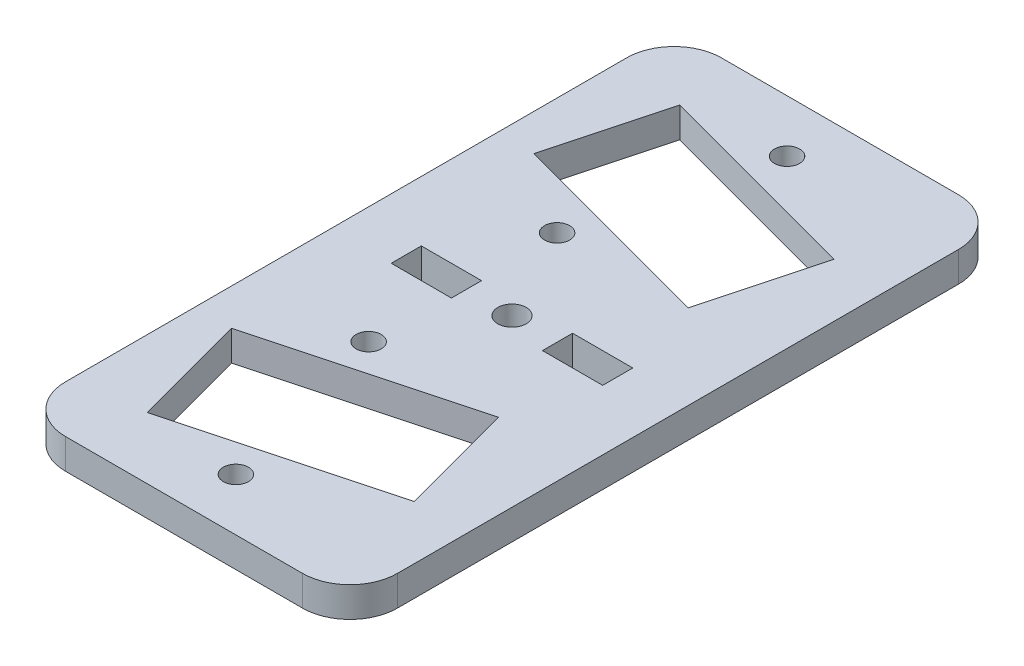
ISO-10303-21;
HEADER;
FILE_DESCRIPTION(('STEP AP214'),'2;1');
FILE_NAME('part.step','',(''),(''),'','','');
FILE_SCHEMA(('AUTOMOTIVE_DESIGN { 1 0 10303 214 1 1 1 1 }'));
ENDSEC;
DATA;
#1=APPLICATION_CONTEXT('core data for automotive mechanical design processes');
#2=APPLICATION_PROTOCOL_DEFINITION('international standard','automotive_design',2000,#1);
#3=PRODUCT_CONTEXT('',#1,'mechanical');
#4=PRODUCT('Part','Part','',(#3));
#5=PRODUCT_RELATED_PRODUCT_CATEGORY('part','',(#4));
#6=PRODUCT_DEFINITION_FORMATION('','',#4);
#7=PRODUCT_DEFINITION_CONTEXT('part definition',#1,'design');
#8=PRODUCT_DEFINITION('design','',#6,#7);
#9=PRODUCT_DEFINITION_SHAPE('','',#8);
#10=(LENGTH_UNIT() NAMED_UNIT(*) SI_UNIT(.MILLI.,.METRE.));
#11=(NAMED_UNIT(*) PLANE_ANGLE_UNIT() SI_UNIT($,.RADIAN.));
#12=(NAMED_UNIT(*) SI_UNIT($,.STERADIAN.) SOLID_ANGLE_UNIT());
#13=UNCERTAINTY_MEASURE_WITH_UNIT(LENGTH_MEASURE(1.E-05),#10,'distance_accuracy_value','');
#14=(GEOMETRIC_REPRESENTATION_CONTEXT(3) GLOBAL_UNCERTAINTY_ASSIGNED_CONTEXT((#13)) GLOBAL_UNIT_ASSIGNED_CONTEXT((#10,
#11,#12)) REPRESENTATION_CONTEXT('',''));
#15=CARTESIAN_POINT('',(0.,0.,0.));
#16=DIRECTION('',(0.,0.,1.));
#17=DIRECTION('',(1.,0.,0.));
#18=AXIS2_PLACEMENT_3D('',#15,#16,#17);
#19=CARTESIAN_POINT('',(241.907481729682,3.175,34.3947344048409));
#20=DIRECTION('',(0.,1.,0.));
#21=DIRECTION('',(0.,0.,1.));
#22=AXIS2_PLACEMENT_3D('',#19,#20,#21);
#23=PLANE('',#22);
#24=CARTESIAN_POINT('',(254.407481729682,3.175,4.8067810577674));
#25=DIRECTION('',(0.,1.,0.));
#26=DIRECTION('',(0.,0.,1.));
#27=AXIS2_PLACEMENT_3D('',#24,#25,#26);
#28=CIRCLE('',#27,1.50000000000002);
#29=CARTESIAN_POINT('',(254.407481729682,3.175,6.30678105776743));
#30=VERTEX_POINT('',#29);
#31=EDGE_CURVE('E229',#30,#30,#28,.T.);
#32=ORIENTED_EDGE('',*,*,#31,.F.);
#33=EDGE_LOOP('',(#32));
#34=FACE_BOUND('',#33,.T.);
#35=DIRECTION('',(-1.,0.,0.));
#36=VECTOR('',#35,1.);
#37=CARTESIAN_POINT('',(243.257481729682,3.175,3.21928105776739));
#38=LINE('',#37,#36);
#39=CARTESIAN_POINT('',(249.607481729682,3.175,3.21928105776739));
#40=VERTEX_POINT('',#39);
#41=CARTESIAN_POINT('',(243.257481729682,3.175,3.21928105776739));
#42=VERTEX_POINT('',#41);
#43=EDGE_CURVE('E268',#40,#42,#38,.T.);
#44=ORIENTED_EDGE('',*,*,#43,.F.);
#45=DIRECTION('',(0.,0.,-1.));
#46=VECTOR('',#45,1.);
#47=CARTESIAN_POINT('',(249.607481729682,3.175,6.39428105776739));
#48=LINE('',#47,#46);
#49=CARTESIAN_POINT('',(249.607481729682,3.175,6.39428105776739));
#50=VERTEX_POINT('',#49);
#51=EDGE_CURVE('E266',#50,#40,#48,.T.);
#52=ORIENTED_EDGE('',*,*,#51,.F.);
#53=DIRECTION('',(1.,0.,0.));
#54=VECTOR('',#53,1.);
#55=CARTESIAN_POINT('',(243.257481729682,3.175,6.39428105776739));
#56=LINE('',#55,#54);
#57=CARTESIAN_POINT('',(243.257481729682,3.175,6.39428105776739));
#58=VERTEX_POINT('',#57);
#59=EDGE_CURVE('E274',#58,#50,#56,.T.);
#60=ORIENTED_EDGE('',*,*,#59,.F.);
#61=DIRECTION('',(0.,0.,1.));
#62=VECTOR('',#61,1.);
#63=CARTESIAN_POINT('',(243.257481729682,3.175,6.39428105776739));
#64=LINE('',#63,#62);
#65=EDGE_CURVE('E271',#42,#58,#64,.T.);
#66=ORIENTED_EDGE('',*,*,#65,.F.);
#67=EDGE_LOOP('',(#44,#52,#60,#66));
#68=FACE_BOUND('',#67,.T.);
#69=CARTESIAN_POINT('',(254.350862196904,3.175,33.8702321091199));
#70=DIRECTION('',(0.,1.,0.));
#71=DIRECTION('',(0.,0.,-1.));
#72=AXIS2_PLACEMENT_3D('',#69,#70,#71);
#73=CIRCLE('',#72,1.3248000009435);
#74=CARTESIAN_POINT('',(254.350862196904,3.175,32.5454321081764));
#75=VERTEX_POINT('',#74);
#76=EDGE_CURVE('E328',#75,#75,#73,.T.);
#77=ORIENTED_EDGE('',*,*,#76,.F.);
#78=EDGE_LOOP('',(#77));
#79=FACE_BOUND('',#78,.T.);
#80=CARTESIAN_POINT('',(249.226245103874,3.175,-5.13133863306153));
#81=DIRECTION('',(0.,1.,0.));
#82=DIRECTION('',(0.,0.,-1.));
#83=AXIS2_PLACEMENT_3D('',#80,#81,#82);
#84=CIRCLE('',#83,1.32480000094353);
#85=CARTESIAN_POINT('',(249.226245103874,3.175,-6.45613863400506));
#86=VERTEX_POINT('',#85);
#87=EDGE_CURVE('E340',#86,#86,#84,.T.);
#88=ORIENTED_EDGE('',*,*,#87,.F.);
#89=EDGE_LOOP('',(#88));
#90=FACE_BOUND('',#89,.T.);
#91=CARTESIAN_POINT('',(241.907481729682,3.175,34.3947344048409));
#92=DIRECTION('',(0.,1.,0.));
#93=DIRECTION('',(0.,0.,1.));
#94=AXIS2_PLACEMENT_3D('',#91,#92,#93);
#95=CIRCLE('',#94,5.);
#96=CARTESIAN_POINT('',(236.907481729682,3.175,34.3947344048409));
#97=VERTEX_POINT('',#96);
#98=CARTESIAN_POINT('',(241.907481729682,3.175,39.3947344048409));
#99=VERTEX_POINT('',#98);
#100=EDGE_CURVE('E352',#97,#99,#95,.T.);
#101=ORIENTED_EDGE('',*,*,#100,.T.);
#102=DIRECTION('',(1.,0.,0.));
#103=VECTOR('',#102,1.);
#104=CARTESIAN_POINT('',(241.907481729682,3.175,39.3947344048409));
#105=LINE('',#104,#103);
#106=CARTESIAN_POINT('',(266.907481729682,3.175,39.3947344048409));
#107=VERTEX_POINT('',#106);
#108=EDGE_CURVE('E355',#99,#107,#105,.T.);
#109=ORIENTED_EDGE('',*,*,#108,.T.);
#110=CARTESIAN_POINT('',(266.907481729682,3.175,34.3947344048409));
#111=DIRECTION('',(0.,1.,0.));
#112=DIRECTION('',(0.,0.,1.));
#113=AXIS2_PLACEMENT_3D('',#110,#111,#112);
#114=CIRCLE('',#113,5.);
#115=CARTESIAN_POINT('',(271.907481729682,3.175,34.3947344048409));
#116=VERTEX_POINT('',#115);
#117=EDGE_CURVE('E358',#107,#116,#114,.T.);
#118=ORIENTED_EDGE('',*,*,#117,.T.);
#119=DIRECTION('',(0.,0.,-1.));
#120=VECTOR('',#119,1.);
#121=CARTESIAN_POINT('',(271.907481729682,3.175,-24.7811722893061));
#122=LINE('',#121,#120);
#123=CARTESIAN_POINT('',(271.907481729682,3.175,-24.7811722893061));
#124=VERTEX_POINT('',#123);
#125=EDGE_CURVE('E360',#116,#124,#122,.T.);
#126=ORIENTED_EDGE('',*,*,#125,.T.);
#127=CARTESIAN_POINT('',(266.907481729682,3.175,-24.7811722893061));
#128=DIRECTION('',(0.,1.,0.));
#129=DIRECTION('',(0.,0.,-1.));
#130=AXIS2_PLACEMENT_3D('',#127,#128,#129);
#131=CIRCLE('',#130,5.);
#132=CARTESIAN_POINT('',(266.907481729682,3.175,-29.7811722893061));
#133=VERTEX_POINT('',#132);
#134=EDGE_CURVE('E362',#124,#133,#131,.T.);
#135=ORIENTED_EDGE('',*,*,#134,.T.);
#136=DIRECTION('',(-1.,0.,0.));
#137=VECTOR('',#136,1.);
#138=CARTESIAN_POINT('',(241.907481729682,3.175,-29.7811722893061));
#139=LINE('',#138,#137);
#140=CARTESIAN_POINT('',(241.907481729682,3.175,-29.7811722893061));
#141=VERTEX_POINT('',#140);
#142=EDGE_CURVE('E364',#133,#141,#139,.T.);
#143=ORIENTED_EDGE('',*,*,#142,.T.);
#144=CARTESIAN_POINT('',(241.907481729682,3.175,-24.7811722893061));
#145=DIRECTION('',(0.,1.,0.));
#146=DIRECTION('',(0.,0.,1.));
#147=AXIS2_PLACEMENT_3D('',#144,#145,#146);
#148=CIRCLE('',#147,5.);
#149=CARTESIAN_POINT('',(236.907481729682,3.175,-24.7811722893061));
#150=VERTEX_POINT('',#149);
#151=EDGE_CURVE('E366',#141,#150,#148,.T.);
#152=ORIENTED_EDGE('',*,*,#151,.T.);
#153=DIRECTION('',(0.,0.,1.));
#154=VECTOR('',#153,1.);
#155=CARTESIAN_POINT('',(236.907481729682,3.175,-24.7811722893061));
#156=LINE('',#155,#154);
#157=EDGE_CURVE('E368',#150,#97,#156,.T.);
#158=ORIENTED_EDGE('',*,*,#157,.T.);
#159=EDGE_LOOP('',(#101,#109,#118,#126,#135,#143,#152,#158));
#160=FACE_BOUND('',#159,.T.);
#161=CARTESIAN_POINT('',(254.350862196904,3.175,-24.2566699935851));
#162=DIRECTION('',(0.,1.,0.));
#163=DIRECTION('',(0.,0.,1.));
#164=AXIS2_PLACEMENT_3D('',#161,#162,#163);
#165=CIRCLE('',#164,1.3248000009435);
#166=CARTESIAN_POINT('',(254.350862196904,3.175,-22.9318699926416));
#167=VERTEX_POINT('',#166);
#168=EDGE_CURVE('E346',#167,#167,#165,.T.);
#169=ORIENTED_EDGE('',*,*,#168,.F.);
#170=EDGE_LOOP('',(#169));
#171=FACE_BOUND('',#170,.T.);
#172=CARTESIAN_POINT('',(249.226245103874,3.175,14.7449007485963));
#173=DIRECTION('',(0.,1.,0.));
#174=DIRECTION('',(0.,0.,1.));
#175=AXIS2_PLACEMENT_3D('',#172,#173,#174);
#176=CIRCLE('',#175,1.32480000094353);
#177=CARTESIAN_POINT('',(249.226245103874,3.175,16.0697007495399));
#178=VERTEX_POINT('',#177);
#179=EDGE_CURVE('E334',#178,#178,#176,.T.);
#180=ORIENTED_EDGE('',*,*,#179,.F.);
#181=EDGE_LOOP('',(#180));
#182=FACE_BOUND('',#181,.T.);
#183=DIRECTION('',(0.258819045102522,0.,0.965925826289068));
#184=VECTOR('',#183,1.);
#185=CARTESIAN_POINT('',(244.025087142604,3.175,32.8866226033748));
#186=LINE('',#185,#184);
#187=CARTESIAN_POINT('',(240.775666345959,3.175,20.7596190951254));
#188=VERTEX_POINT('',#187);
#189=CARTESIAN_POINT('',(244.025087142604,3.175,32.8866226033748));
#190=VERTEX_POINT('',#189);
#191=EDGE_CURVE('E299',#188,#190,#186,.T.);
#192=ORIENTED_EDGE('',*,*,#191,.F.);
#193=DIRECTION('',(-0.965925826289068,0.,0.258819045102521));
#194=VECTOR('',#193,1.);
#195=CARTESIAN_POINT('',(240.775666345959,3.175,20.7596190951254));
#196=LINE('',#195,#194);
#197=CARTESIAN_POINT('',(262.991960350608,3.175,14.8067810577674));
#198=VERTEX_POINT('',#197);
#199=EDGE_CURVE('E297',#198,#188,#196,.T.);
#200=ORIENTED_EDGE('',*,*,#199,.F.);
#201=DIRECTION('',(-0.258819045102524,0.,-0.965925826289067));
#202=VECTOR('',#201,1.);
#203=CARTESIAN_POINT('',(262.991960350608,3.175,14.8067810577674));
#204=LINE('',#203,#202);
#205=CARTESIAN_POINT('',(266.241381147253,3.175,26.9337845660168));
#206=VERTEX_POINT('',#205);
#207=EDGE_CURVE('E305',#206,#198,#204,.T.);
#208=ORIENTED_EDGE('',*,*,#207,.F.);
#209=DIRECTION('',(0.965925826289068,0.,-0.258819045102522));
#210=VECTOR('',#209,1.);
#211=CARTESIAN_POINT('',(266.241381147253,3.175,26.9337845660168));
#212=LINE('',#211,#210);
#213=EDGE_CURVE('E302',#190,#206,#212,.T.);
#214=ORIENTED_EDGE('',*,*,#213,.F.);
#215=EDGE_LOOP('',(#192,#200,#208,#214));
#216=FACE_BOUND('',#215,.T.);
#217=DIRECTION('',(-1.,0.,0.));
#218=VECTOR('',#217,1.);
#219=CARTESIAN_POINT('',(259.207481729682,3.175,3.2192810577674));
#220=LINE('',#219,#218);
#221=CARTESIAN_POINT('',(265.557481729682,3.175,3.2192810577674));
#222=VERTEX_POINT('',#221);
#223=CARTESIAN_POINT('',(259.207481729682,3.175,3.2192810577674));
#224=VERTEX_POINT('',#223);
#225=EDGE_CURVE('E237',#222,#224,#220,.T.);
#226=ORIENTED_EDGE('',*,*,#225,.F.);
#227=DIRECTION('',(0.,0.,-1.));
#228=VECTOR('',#227,1.);
#229=CARTESIAN_POINT('',(265.557481729682,3.175,6.39428105776741));
#230=LINE('',#229,#228);
#231=CARTESIAN_POINT('',(265.557481729682,3.175,6.39428105776741));
#232=VERTEX_POINT('',#231);
#233=EDGE_CURVE('E235',#232,#222,#230,.T.);
#234=ORIENTED_EDGE('',*,*,#233,.F.);
#235=DIRECTION('',(1.,0.,0.));
#236=VECTOR('',#235,1.);
#237=CARTESIAN_POINT('',(259.207481729682,3.175,6.39428105776741));
#238=LINE('',#237,#236);
#239=CARTESIAN_POINT('',(259.207481729682,3.175,6.39428105776741));
#240=VERTEX_POINT('',#239);
#241=EDGE_CURVE('E243',#240,#232,#238,.T.);
#242=ORIENTED_EDGE('',*,*,#241,.F.);
#243=DIRECTION('',(0.,0.,1.));
#244=VECTOR('',#243,1.);
#245=CARTESIAN_POINT('',(259.207481729682,3.175,6.39428105776741));
#246=LINE('',#245,#244);
#247=EDGE_CURVE('E240',#224,#240,#246,.T.);
#248=ORIENTED_EDGE('',*,*,#247,.F.);
#249=EDGE_LOOP('',(#226,#234,#242,#248));
#250=FACE_BOUND('',#249,.T.);
#251=DIRECTION('',(-0.258819045102523,0.,0.965925826289068));
#252=VECTOR('',#251,1.);
#253=CARTESIAN_POINT('',(240.775666345959,3.175,-11.1460569795906));
#254=LINE('',#253,#252);
#255=CARTESIAN_POINT('',(244.025087142604,3.175,-23.27306048784));
#256=VERTEX_POINT('',#255);
#257=CARTESIAN_POINT('',(240.775666345959,3.175,-11.1460569795906));
#258=VERTEX_POINT('',#257);
#259=EDGE_CURVE('E201',#256,#258,#254,.T.);
#260=ORIENTED_EDGE('',*,*,#259,.F.);
#261=DIRECTION('',(-0.965925826289068,0.,-0.258819045102522));
#262=VECTOR('',#261,1.);
#263=CARTESIAN_POINT('',(244.025087142604,3.175,-23.27306048784));
#264=LINE('',#263,#262);
#265=CARTESIAN_POINT('',(266.241381147253,3.175,-17.320222450482));
#266=VERTEX_POINT('',#265);
#267=EDGE_CURVE('E193',#266,#256,#264,.T.);
#268=ORIENTED_EDGE('',*,*,#267,.F.);
#269=DIRECTION('',(0.258819045102524,0.,-0.965925826289067));
#270=VECTOR('',#269,1.);
#271=CARTESIAN_POINT('',(262.991960350608,3.175,-5.19321894223259));
#272=LINE('',#271,#270);
#273=CARTESIAN_POINT('',(262.991960350608,3.175,-5.1932189422326));
#274=VERTEX_POINT('',#273);
#275=EDGE_CURVE('E215',#274,#266,#272,.T.);
#276=ORIENTED_EDGE('',*,*,#275,.F.);
#277=DIRECTION('',(0.965925826289068,0.,0.258819045102523));
#278=VECTOR('',#277,1.);
#279=CARTESIAN_POINT('',(240.775666345959,3.175,-11.1460569795906));
#280=LINE('',#279,#278);
#281=EDGE_CURVE('E213',#258,#274,#280,.T.);
#282=ORIENTED_EDGE('',*,*,#281,.F.);
#283=EDGE_LOOP('',(#260,#268,#276,#282));
#284=FACE_BOUND('',#283,.T.);
#285=ADVANCED_FACE('F32',(#34,#68,#79,#90,#160,#171,#182,#216,#250,#284),#23,.T.);
#286=CARTESIAN_POINT('',(241.907481729682,0.,34.3947344048409));
#287=DIRECTION('',(0.,1.,0.));
#288=DIRECTION('',(0.,0.,1.));
#289=AXIS2_PLACEMENT_3D('',#286,#287,#288);
#290=PLANE('',#289);
#291=CARTESIAN_POINT('',(254.407481729682,0.,4.8067810577674));
#292=DIRECTION('',(0.,1.,0.));
#293=DIRECTION('',(0.,0.,1.));
#294=AXIS2_PLACEMENT_3D('',#291,#292,#293);
#295=CIRCLE('',#294,1.50000000000002);
#296=CARTESIAN_POINT('',(254.407481729682,0.,6.30678105776743));
#297=VERTEX_POINT('',#296);
#298=EDGE_CURVE('E209',#297,#297,#295,.T.);
#299=ORIENTED_EDGE('',*,*,#298,.T.);
#300=EDGE_LOOP('',(#299));
#301=FACE_BOUND('',#300,.T.);
#302=DIRECTION('',(0.,0.,-1.));
#303=VECTOR('',#302,1.);
#304=CARTESIAN_POINT('',(249.607481729682,0.,6.39428105776739));
#305=LINE('',#304,#303);
#306=CARTESIAN_POINT('',(249.607481729682,0.,6.39428105776739));
#307=VERTEX_POINT('',#306);
#308=CARTESIAN_POINT('',(249.607481729682,0.,3.21928105776739));
#309=VERTEX_POINT('',#308);
#310=EDGE_CURVE('E265',#307,#309,#305,.T.);
#311=ORIENTED_EDGE('',*,*,#310,.T.);
#312=DIRECTION('',(-1.,0.,0.));
#313=VECTOR('',#312,1.);
#314=CARTESIAN_POINT('',(243.257481729682,0.,3.21928105776739));
#315=LINE('',#314,#313);
#316=CARTESIAN_POINT('',(243.257481729682,0.,3.21928105776739));
#317=VERTEX_POINT('',#316);
#318=EDGE_CURVE('E279',#309,#317,#315,.T.);
#319=ORIENTED_EDGE('',*,*,#318,.T.);
#320=DIRECTION('',(0.,0.,1.));
#321=VECTOR('',#320,1.);
#322=CARTESIAN_POINT('',(243.257481729682,0.,6.39428105776739));
#323=LINE('',#322,#321);
#324=CARTESIAN_POINT('',(243.257481729682,0.,6.39428105776739));
#325=VERTEX_POINT('',#324);
#326=EDGE_CURVE('E282',#317,#325,#323,.T.);
#327=ORIENTED_EDGE('',*,*,#326,.T.);
#328=DIRECTION('',(1.,0.,0.));
#329=VECTOR('',#328,1.);
#330=CARTESIAN_POINT('',(243.257481729682,0.,6.39428105776739));
#331=LINE('',#330,#329);
#332=EDGE_CURVE('E269',#325,#307,#331,.T.);
#333=ORIENTED_EDGE('',*,*,#332,.T.);
#334=EDGE_LOOP('',(#311,#319,#327,#333));
#335=FACE_BOUND('',#334,.T.);
#336=CARTESIAN_POINT('',(254.350862196904,0.,33.8702321091199));
#337=DIRECTION('',(0.,1.,0.));
#338=DIRECTION('',(0.,0.,-1.));
#339=AXIS2_PLACEMENT_3D('',#336,#337,#338);
#340=CIRCLE('',#339,1.3248000009435);
#341=CARTESIAN_POINT('',(254.350862196904,0.,32.5454321081764));
#342=VERTEX_POINT('',#341);
#343=EDGE_CURVE('E327',#342,#342,#340,.T.);
#344=ORIENTED_EDGE('',*,*,#343,.T.);
#345=EDGE_LOOP('',(#344));
#346=FACE_BOUND('',#345,.T.);
#347=CARTESIAN_POINT('',(249.226245103874,0.,-5.13133863306153));
#348=DIRECTION('',(0.,1.,0.));
#349=DIRECTION('',(0.,0.,-1.));
#350=AXIS2_PLACEMENT_3D('',#347,#348,#349);
#351=CIRCLE('',#350,1.32480000094353);
#352=CARTESIAN_POINT('',(249.226245103874,0.,-6.45613863400506));
#353=VERTEX_POINT('',#352);
#354=EDGE_CURVE('E337',#353,#353,#351,.T.);
#355=ORIENTED_EDGE('',*,*,#354,.T.);
#356=EDGE_LOOP('',(#355));
#357=FACE_BOUND('',#356,.T.);
#358=CARTESIAN_POINT('',(241.907481729682,0.,34.3947344048409));
#359=DIRECTION('',(0.,1.,0.));
#360=DIRECTION('',(0.,0.,1.));
#361=AXIS2_PLACEMENT_3D('',#358,#359,#360);
#362=CIRCLE('',#361,5.);
#363=CARTESIAN_POINT('',(236.907481729682,0.,34.3947344048409));
#364=VERTEX_POINT('',#363);
#365=CARTESIAN_POINT('',(241.907481729682,0.,39.3947344048409));
#366=VERTEX_POINT('',#365);
#367=EDGE_CURVE('E349',#364,#366,#362,.T.);
#368=ORIENTED_EDGE('',*,*,#367,.F.);
#369=DIRECTION('',(0.,0.,1.));
#370=VECTOR('',#369,1.);
#371=CARTESIAN_POINT('',(236.907481729682,0.,-24.7811722893061));
#372=LINE('',#371,#370);
#373=CARTESIAN_POINT('',(236.907481729682,0.,-24.7811722893061));
#374=VERTEX_POINT('',#373);
#375=EDGE_CURVE('E356',#374,#364,#372,.T.);
#376=ORIENTED_EDGE('',*,*,#375,.F.);
#377=CARTESIAN_POINT('',(241.907481729682,0.,-24.7811722893061));
#378=DIRECTION('',(0.,1.,0.));
#379=DIRECTION('',(0.,0.,1.));
#380=AXIS2_PLACEMENT_3D('',#377,#378,#379);
#381=CIRCLE('',#380,5.);
#382=CARTESIAN_POINT('',(241.907481729682,0.,-29.7811722893061));
#383=VERTEX_POINT('',#382);
#384=EDGE_CURVE('E383',#383,#374,#381,.T.);
#385=ORIENTED_EDGE('',*,*,#384,.F.);
#386=DIRECTION('',(-1.,0.,0.));
#387=VECTOR('',#386,1.);
#388=CARTESIAN_POINT('',(241.907481729682,0.,-29.7811722893061));
#389=LINE('',#388,#387);
#390=CARTESIAN_POINT('',(266.907481729682,0.,-29.7811722893061));
#391=VERTEX_POINT('',#390);
#392=EDGE_CURVE('E381',#391,#383,#389,.T.);
#393=ORIENTED_EDGE('',*,*,#392,.F.);
#394=CARTESIAN_POINT('',(266.907481729682,0.,-24.7811722893061));
#395=DIRECTION('',(0.,1.,0.));
#396=DIRECTION('',(0.,0.,-1.));
#397=AXIS2_PLACEMENT_3D('',#394,#395,#396);
#398=CIRCLE('',#397,5.);
#399=CARTESIAN_POINT('',(271.907481729682,0.,-24.7811722893061));
#400=VERTEX_POINT('',#399);
#401=EDGE_CURVE('E379',#400,#391,#398,.T.);
#402=ORIENTED_EDGE('',*,*,#401,.F.);
#403=DIRECTION('',(0.,0.,-1.));
#404=VECTOR('',#403,1.);
#405=CARTESIAN_POINT('',(271.907481729682,0.,-24.7811722893061));
#406=LINE('',#405,#404);
#407=CARTESIAN_POINT('',(271.907481729682,0.,34.3947344048409));
#408=VERTEX_POINT('',#407);
#409=EDGE_CURVE('E377',#408,#400,#406,.T.);
#410=ORIENTED_EDGE('',*,*,#409,.F.);
#411=CARTESIAN_POINT('',(266.907481729682,0.,34.3947344048409));
#412=DIRECTION('',(0.,1.,0.));
#413=DIRECTION('',(0.,0.,1.));
#414=AXIS2_PLACEMENT_3D('',#411,#412,#413);
#415=CIRCLE('',#414,5.);
#416=CARTESIAN_POINT('',(266.907481729682,0.,39.3947344048409));
#417=VERTEX_POINT('',#416);
#418=EDGE_CURVE('E375',#417,#408,#415,.T.);
#419=ORIENTED_EDGE('',*,*,#418,.F.);
#420=DIRECTION('',(1.,0.,0.));
#421=VECTOR('',#420,1.);
#422=CARTESIAN_POINT('',(241.907481729682,0.,39.3947344048409));
#423=LINE('',#422,#421);
#424=EDGE_CURVE('E373',#366,#417,#423,.T.);
#425=ORIENTED_EDGE('',*,*,#424,.F.);
#426=EDGE_LOOP('',(#368,#376,#385,#393,#402,#410,#419,#425));
#427=FACE_BOUND('',#426,.T.);
#428=CARTESIAN_POINT('',(254.350862196904,0.,-24.2566699935851));
#429=DIRECTION('',(0.,1.,0.));
#430=DIRECTION('',(0.,0.,1.));
#431=AXIS2_PLACEMENT_3D('',#428,#429,#430);
#432=CIRCLE('',#431,1.3248000009435);
#433=CARTESIAN_POINT('',(254.350862196904,0.,-22.9318699926416));
#434=VERTEX_POINT('',#433);
#435=EDGE_CURVE('E343',#434,#434,#432,.T.);
#436=ORIENTED_EDGE('',*,*,#435,.T.);
#437=EDGE_LOOP('',(#436));
#438=FACE_BOUND('',#437,.T.);
#439=CARTESIAN_POINT('',(249.226245103874,0.,14.7449007485963));
#440=DIRECTION('',(0.,1.,0.));
#441=DIRECTION('',(0.,0.,1.));
#442=AXIS2_PLACEMENT_3D('',#439,#440,#441);
#443=CIRCLE('',#442,1.32480000094353);
#444=CARTESIAN_POINT('',(249.226245103874,0.,16.0697007495399));
#445=VERTEX_POINT('',#444);
#446=EDGE_CURVE('E331',#445,#445,#443,.T.);
#447=ORIENTED_EDGE('',*,*,#446,.T.);
#448=EDGE_LOOP('',(#447));
#449=FACE_BOUND('',#448,.T.);
#450=DIRECTION('',(-0.965925826289068,0.,0.258819045102521));
#451=VECTOR('',#450,1.);
#452=CARTESIAN_POINT('',(240.775666345959,0.,20.7596190951254));
#453=LINE('',#452,#451);
#454=CARTESIAN_POINT('',(262.991960350608,0.,14.8067810577674));
#455=VERTEX_POINT('',#454);
#456=CARTESIAN_POINT('',(240.775666345959,0.,20.7596190951254));
#457=VERTEX_POINT('',#456);
#458=EDGE_CURVE('E296',#455,#457,#453,.T.);
#459=ORIENTED_EDGE('',*,*,#458,.T.);
#460=DIRECTION('',(0.258819045102522,0.,0.965925826289068));
#461=VECTOR('',#460,1.);
#462=CARTESIAN_POINT('',(244.025087142604,0.,32.8866226033748));
#463=LINE('',#462,#461);
#464=CARTESIAN_POINT('',(244.025087142604,0.,32.8866226033748));
#465=VERTEX_POINT('',#464);
#466=EDGE_CURVE('E310',#457,#465,#463,.T.);
#467=ORIENTED_EDGE('',*,*,#466,.T.);
#468=DIRECTION('',(0.965925826289068,0.,-0.258819045102522));
#469=VECTOR('',#468,1.);
#470=CARTESIAN_POINT('',(266.241381147253,0.,26.9337845660168));
#471=LINE('',#470,#469);
#472=CARTESIAN_POINT('',(266.241381147253,0.,26.9337845660168));
#473=VERTEX_POINT('',#472);
#474=EDGE_CURVE('E313',#465,#473,#471,.T.);
#475=ORIENTED_EDGE('',*,*,#474,.T.);
#476=DIRECTION('',(-0.258819045102524,0.,-0.965925826289067));
#477=VECTOR('',#476,1.);
#478=CARTESIAN_POINT('',(262.991960350608,0.,14.8067810577674));
#479=LINE('',#478,#477);
#480=EDGE_CURVE('E300',#473,#455,#479,.T.);
#481=ORIENTED_EDGE('',*,*,#480,.T.);
#482=EDGE_LOOP('',(#459,#467,#475,#481));
#483=FACE_BOUND('',#482,.T.);
#484=DIRECTION('',(0.,0.,-1.));
#485=VECTOR('',#484,1.);
#486=CARTESIAN_POINT('',(265.557481729682,0.,6.39428105776741));
#487=LINE('',#486,#485);
#488=CARTESIAN_POINT('',(265.557481729682,0.,6.39428105776741));
#489=VERTEX_POINT('',#488);
#490=CARTESIAN_POINT('',(265.557481729682,0.,3.2192810577674));
#491=VERTEX_POINT('',#490);
#492=EDGE_CURVE('E232',#489,#491,#487,.T.);
#493=ORIENTED_EDGE('',*,*,#492,.T.);
#494=DIRECTION('',(-1.,0.,0.));
#495=VECTOR('',#494,1.);
#496=CARTESIAN_POINT('',(259.207481729682,0.,3.2192810577674));
#497=LINE('',#496,#495);
#498=CARTESIAN_POINT('',(259.207481729682,0.,3.2192810577674));
#499=VERTEX_POINT('',#498);
#500=EDGE_CURVE('E248',#491,#499,#497,.T.);
#501=ORIENTED_EDGE('',*,*,#500,.T.);
#502=DIRECTION('',(0.,0.,1.));
#503=VECTOR('',#502,1.);
#504=CARTESIAN_POINT('',(259.207481729682,0.,6.39428105776741));
#505=LINE('',#504,#503);
#506=CARTESIAN_POINT('',(259.207481729682,0.,6.39428105776741));
#507=VERTEX_POINT('',#506);
#508=EDGE_CURVE('E251',#499,#507,#505,.T.);
#509=ORIENTED_EDGE('',*,*,#508,.T.);
#510=DIRECTION('',(1.,0.,0.));
#511=VECTOR('',#510,1.);
#512=CARTESIAN_POINT('',(259.207481729682,0.,6.39428105776741));
#513=LINE('',#512,#511);
#514=EDGE_CURVE('E238',#507,#489,#513,.T.);
#515=ORIENTED_EDGE('',*,*,#514,.T.);
#516=EDGE_LOOP('',(#493,#501,#509,#515));
#517=FACE_BOUND('',#516,.T.);
#518=DIRECTION('',(-0.965925826289068,0.,-0.258819045102522));
#519=VECTOR('',#518,1.);
#520=CARTESIAN_POINT('',(244.025087142604,0.,-23.27306048784));
#521=LINE('',#520,#519);
#522=CARTESIAN_POINT('',(266.241381147253,0.,-17.320222450482));
#523=VERTEX_POINT('',#522);
#524=CARTESIAN_POINT('',(244.025087142604,0.,-23.27306048784));
#525=VERTEX_POINT('',#524);
#526=EDGE_CURVE('E55',#523,#525,#521,.T.);
#527=ORIENTED_EDGE('',*,*,#526,.T.);
#528=DIRECTION('',(-0.258819045102523,0.,0.965925826289068));
#529=VECTOR('',#528,1.);
#530=CARTESIAN_POINT('',(240.775666345959,0.,-11.1460569795906));
#531=LINE('',#530,#529);
#532=CARTESIAN_POINT('',(240.775666345959,0.,-11.1460569795906));
#533=VERTEX_POINT('',#532);
#534=EDGE_CURVE('E208',#525,#533,#531,.T.);
#535=ORIENTED_EDGE('',*,*,#534,.T.);
#536=DIRECTION('',(0.965925826289068,0.,0.258819045102523));
#537=VECTOR('',#536,1.);
#538=CARTESIAN_POINT('',(240.775666345959,0.,-11.1460569795906));
#539=LINE('',#538,#537);
#540=CARTESIAN_POINT('',(262.991960350608,0.,-5.19321894223259));
#541=VERTEX_POINT('',#540);
#542=EDGE_CURVE('E221',#533,#541,#539,.T.);
#543=ORIENTED_EDGE('',*,*,#542,.T.);
#544=DIRECTION('',(0.258819045102524,0.,-0.965925826289067));
#545=VECTOR('',#544,1.);
#546=CARTESIAN_POINT('',(262.991960350608,0.,-5.19321894223259));
#547=LINE('',#546,#545);
#548=EDGE_CURVE('E202',#541,#523,#547,.T.);
#549=ORIENTED_EDGE('',*,*,#548,.T.);
#550=EDGE_LOOP('',(#527,#535,#543,#549));
#551=FACE_BOUND('',#550,.T.);
#552=ADVANCED_FACE('F413',(#301,#335,#346,#357,#427,#438,#449,#483,#517,#551),#290,.F.);
#553=CARTESIAN_POINT('',(241.907481729682,3.175,34.3947344048409));
#554=DIRECTION('',(0.,-1.,0.));
#555=DIRECTION('',(0.,0.,-1.));
#556=AXIS2_PLACEMENT_3D('',#553,#554,#555);
#557=CYLINDRICAL_SURFACE('',#556,5.);
#558=ORIENTED_EDGE('',*,*,#367,.T.);
#559=DIRECTION('',(0.,-1.,0.));
#560=VECTOR('',#559,1.);
#561=CARTESIAN_POINT('',(241.907481729682,3.175,39.3947344048409));
#562=LINE('',#561,#560);
#563=EDGE_CURVE('E11',#99,#366,#562,.T.);
#564=ORIENTED_EDGE('',*,*,#563,.F.);
#565=ORIENTED_EDGE('',*,*,#100,.F.);
#566=DIRECTION('',(0.,-1.,0.));
#567=VECTOR('',#566,1.);
#568=CARTESIAN_POINT('',(236.907481729682,3.175,34.3947344048409));
#569=LINE('',#568,#567);
#570=EDGE_CURVE('E370',#97,#364,#569,.T.);
#571=ORIENTED_EDGE('',*,*,#570,.T.);
#572=EDGE_LOOP('',(#558,#564,#565,#571));
#573=FACE_BOUND('',#572,.T.);
#574=ADVANCED_FACE('F34',(#573),#557,.T.);
#575=CARTESIAN_POINT('',(241.907481729682,3.175,39.3947344048409));
#576=DIRECTION('',(0.,0.,-1.));
#577=DIRECTION('',(-1.,0.,0.));
#578=AXIS2_PLACEMENT_3D('',#575,#576,#577);
#579=PLANE('',#578);
#580=ORIENTED_EDGE('',*,*,#424,.T.);
#581=DIRECTION('',(0.,-1.,0.));
#582=VECTOR('',#581,1.);
#583=CARTESIAN_POINT('',(266.907481729682,3.175,39.3947344048409));
#584=LINE('',#583,#582);
#585=EDGE_CURVE('E40',#107,#417,#584,.T.);
#586=ORIENTED_EDGE('',*,*,#585,.F.);
#587=ORIENTED_EDGE('',*,*,#108,.F.);
#588=ORIENTED_EDGE('',*,*,#563,.T.);
#589=EDGE_LOOP('',(#580,#586,#587,#588));
#590=FACE_BOUND('',#589,.T.);
#591=ADVANCED_FACE('F431',(#590),#579,.F.);
#592=CARTESIAN_POINT('',(266.907481729682,3.175,34.3947344048409));
#593=DIRECTION('',(0.,-1.,0.));
#594=DIRECTION('',(0.,0.,-1.));
#595=AXIS2_PLACEMENT_3D('',#592,#593,#594);
#596=CYLINDRICAL_SURFACE('',#595,5.);
#597=ORIENTED_EDGE('',*,*,#418,.T.);
#598=DIRECTION('',(0.,-1.,0.));
#599=VECTOR('',#598,1.);
#600=CARTESIAN_POINT('',(271.907481729682,3.175,34.3947344048409));
#601=LINE('',#600,#599);
#602=EDGE_CURVE('E400',#116,#408,#601,.T.);
#603=ORIENTED_EDGE('',*,*,#602,.F.);
#604=ORIENTED_EDGE('',*,*,#117,.F.);
#605=ORIENTED_EDGE('',*,*,#585,.T.);
#606=EDGE_LOOP('',(#597,#603,#604,#605));
#607=FACE_BOUND('',#606,.T.);
#608=ADVANCED_FACE('F407',(#607),#596,.T.);
#609=CARTESIAN_POINT('',(271.907481729682,3.175,-24.7811722893061));
#610=DIRECTION('',(-1.,0.,0.));
#611=DIRECTION('',(0.,0.,1.));
#612=AXIS2_PLACEMENT_3D('',#609,#610,#611);
#613=PLANE('',#612);
#614=ORIENTED_EDGE('',*,*,#409,.T.);
#615=DIRECTION('',(0.,-1.,0.));
#616=VECTOR('',#615,1.);
#617=CARTESIAN_POINT('',(271.907481729682,3.175,-24.7811722893061));
#618=LINE('',#617,#616);
#619=EDGE_CURVE('E397',#124,#400,#618,.T.);
#620=ORIENTED_EDGE('',*,*,#619,.F.);
#621=ORIENTED_EDGE('',*,*,#125,.F.);
#622=ORIENTED_EDGE('',*,*,#602,.T.);
#623=EDGE_LOOP('',(#614,#620,#621,#622));
#624=FACE_BOUND('',#623,.T.);
#625=ADVANCED_FACE('F419',(#624),#613,.F.);
#626=CARTESIAN_POINT('',(266.907481729682,3.175,-24.7811722893061));
#627=DIRECTION('',(0.,-1.,0.));
#628=DIRECTION('',(0.,0.,-1.));
#629=AXIS2_PLACEMENT_3D('',#626,#627,#628);
#630=CYLINDRICAL_SURFACE('',#629,5.);
#631=ORIENTED_EDGE('',*,*,#401,.T.);
#632=DIRECTION('',(0.,-1.,0.));
#633=VECTOR('',#632,1.);
#634=CARTESIAN_POINT('',(266.907481729682,3.175,-29.7811722893061));
#635=LINE('',#634,#633);
#636=EDGE_CURVE('E394',#133,#391,#635,.T.);
#637=ORIENTED_EDGE('',*,*,#636,.F.);
#638=ORIENTED_EDGE('',*,*,#134,.F.);
#639=ORIENTED_EDGE('',*,*,#619,.T.);
#640=EDGE_LOOP('',(#631,#637,#638,#639));
#641=FACE_BOUND('',#640,.T.);
#642=ADVANCED_FACE('F423',(#641),#630,.T.);
#643=CARTESIAN_POINT('',(241.907481729682,3.175,-29.7811722893061));
#644=DIRECTION('',(0.,0.,1.));
#645=DIRECTION('',(1.,0.,0.));
#646=AXIS2_PLACEMENT_3D('',#643,#644,#645);
#647=PLANE('',#646);
#648=ORIENTED_EDGE('',*,*,#392,.T.);
#649=DIRECTION('',(0.,-1.,0.));
#650=VECTOR('',#649,1.);
#651=CARTESIAN_POINT('',(241.907481729682,3.175,-29.7811722893061));
#652=LINE('',#651,#650);
#653=EDGE_CURVE('E391',#141,#383,#652,.T.);
#654=ORIENTED_EDGE('',*,*,#653,.F.);
#655=ORIENTED_EDGE('',*,*,#142,.F.);
#656=ORIENTED_EDGE('',*,*,#636,.T.);
#657=EDGE_LOOP('',(#648,#654,#655,#656));
#658=FACE_BOUND('',#657,.T.);
#659=ADVANCED_FACE('F444',(#658),#647,.F.);
#660=CARTESIAN_POINT('',(241.907481729682,3.175,-24.7811722893061));
#661=DIRECTION('',(0.,-1.,0.));
#662=DIRECTION('',(0.,0.,-1.));
#663=AXIS2_PLACEMENT_3D('',#660,#661,#662);
#664=CYLINDRICAL_SURFACE('',#663,5.);
#665=ORIENTED_EDGE('',*,*,#384,.T.);
#666=DIRECTION('',(0.,-1.,0.));
#667=VECTOR('',#666,1.);
#668=CARTESIAN_POINT('',(236.907481729682,3.175,-24.7811722893061));
#669=LINE('',#668,#667);
#670=EDGE_CURVE('E388',#150,#374,#669,.T.);
#671=ORIENTED_EDGE('',*,*,#670,.F.);
#672=ORIENTED_EDGE('',*,*,#151,.F.);
#673=ORIENTED_EDGE('',*,*,#653,.T.);
#674=EDGE_LOOP('',(#665,#671,#672,#673));
#675=FACE_BOUND('',#674,.T.);
#676=ADVANCED_FACE('F442',(#675),#664,.T.);
#677=CARTESIAN_POINT('',(236.907481729682,3.175,-24.7811722893061));
#678=DIRECTION('',(1.,0.,0.));
#679=DIRECTION('',(0.,0.,-1.));
#680=AXIS2_PLACEMENT_3D('',#677,#678,#679);
#681=PLANE('',#680);
#682=ORIENTED_EDGE('',*,*,#375,.T.);
#683=ORIENTED_EDGE('',*,*,#570,.F.);
#684=ORIENTED_EDGE('',*,*,#157,.F.);
#685=ORIENTED_EDGE('',*,*,#670,.T.);
#686=EDGE_LOOP('',(#682,#683,#684,#685));
#687=FACE_BOUND('',#686,.T.);
#688=ADVANCED_FACE('F437',(#687),#681,.F.);
#689=CARTESIAN_POINT('',(254.350862196904,3.175,-24.2566699935851));
#690=DIRECTION('',(0.,-1.,0.));
#691=DIRECTION('',(0.,0.,-1.));
#692=AXIS2_PLACEMENT_3D('',#689,#690,#691);
#693=CYLINDRICAL_SURFACE('',#692,1.3248000009435);
#694=ORIENTED_EDGE('',*,*,#168,.T.);
#695=EDGE_LOOP('',(#694));
#696=FACE_BOUND('',#695,.T.);
#697=ORIENTED_EDGE('',*,*,#435,.F.);
#698=EDGE_LOOP('',(#697));
#699=FACE_BOUND('',#698,.T.);
#700=ADVANCED_FACE('F464',(#696,#699),#693,.F.);
#701=CARTESIAN_POINT('',(249.226245103874,3.175,-5.13133863306153));
#702=DIRECTION('',(0.,-1.,0.));
#703=DIRECTION('',(0.,0.,-1.));
#704=AXIS2_PLACEMENT_3D('',#701,#702,#703);
#705=CYLINDRICAL_SURFACE('',#704,1.32480000094353);
#706=ORIENTED_EDGE('',*,*,#87,.T.);
#707=EDGE_LOOP('',(#706));
#708=FACE_BOUND('',#707,.T.);
#709=ORIENTED_EDGE('',*,*,#354,.F.);
#710=EDGE_LOOP('',(#709));
#711=FACE_BOUND('',#710,.T.);
#712=ADVANCED_FACE('F471',(#708,#711),#705,.F.);
#713=CARTESIAN_POINT('',(249.226245103874,3.175,14.7449007485963));
#714=DIRECTION('',(0.,-1.,0.));
#715=DIRECTION('',(0.,0.,-1.));
#716=AXIS2_PLACEMENT_3D('',#713,#714,#715);
#717=CYLINDRICAL_SURFACE('',#716,1.32480000094353);
#718=ORIENTED_EDGE('',*,*,#179,.T.);
#719=EDGE_LOOP('',(#718));
#720=FACE_BOUND('',#719,.T.);
#721=ORIENTED_EDGE('',*,*,#446,.F.);
#722=EDGE_LOOP('',(#721));
#723=FACE_BOUND('',#722,.T.);
#724=ADVANCED_FACE('F476',(#720,#723),#717,.F.);
#725=CARTESIAN_POINT('',(254.350862196904,3.175,33.8702321091199));
#726=DIRECTION('',(0.,-1.,0.));
#727=DIRECTION('',(0.,0.,-1.));
#728=AXIS2_PLACEMENT_3D('',#725,#726,#727);
#729=CYLINDRICAL_SURFACE('',#728,1.3248000009435);
#730=ORIENTED_EDGE('',*,*,#76,.T.);
#731=EDGE_LOOP('',(#730));
#732=FACE_BOUND('',#731,.T.);
#733=ORIENTED_EDGE('',*,*,#343,.F.);
#734=EDGE_LOOP('',(#733));
#735=FACE_BOUND('',#734,.T.);
#736=ADVANCED_FACE('F552',(#732,#735),#729,.F.);
#737=CARTESIAN_POINT('',(240.775666345959,3.175,20.7596190951254));
#738=DIRECTION('',(0.258819045102521,0.,0.965925826289068));
#739=DIRECTION('',(0.965925826289068,0.,-0.258819045102521));
#740=AXIS2_PLACEMENT_3D('',#737,#738,#739);
#741=PLANE('',#740);
#742=ORIENTED_EDGE('',*,*,#458,.F.);
#743=DIRECTION('',(0.,-1.,0.));
#744=VECTOR('',#743,1.);
#745=CARTESIAN_POINT('',(262.991960350608,3.175,14.8067810577674));
#746=LINE('',#745,#744);
#747=EDGE_CURVE('E307',#198,#455,#746,.T.);
#748=ORIENTED_EDGE('',*,*,#747,.F.);
#749=ORIENTED_EDGE('',*,*,#199,.T.);
#750=DIRECTION('',(0.,-1.,0.));
#751=VECTOR('',#750,1.);
#752=CARTESIAN_POINT('',(240.775666345959,3.175,20.7596190951254));
#753=LINE('',#752,#751);
#754=EDGE_CURVE('E324',#188,#457,#753,.T.);
#755=ORIENTED_EDGE('',*,*,#754,.T.);
#756=EDGE_LOOP('',(#742,#748,#749,#755));
#757=FACE_BOUND('',#756,.T.);
#758=ADVANCED_FACE('F548',(#757),#741,.T.);
#759=CARTESIAN_POINT('',(244.025087142604,3.175,32.8866226033748));
#760=DIRECTION('',(0.965925826289068,0.,-0.258819045102522));
#761=DIRECTION('',(-0.258819045102522,0.,-0.965925826289068));
#762=AXIS2_PLACEMENT_3D('',#759,#760,#761);
#763=PLANE('',#762);
#764=ORIENTED_EDGE('',*,*,#466,.F.);
#765=ORIENTED_EDGE('',*,*,#754,.F.);
#766=ORIENTED_EDGE('',*,*,#191,.T.);
#767=DIRECTION('',(0.,-1.,0.));
#768=VECTOR('',#767,1.);
#769=CARTESIAN_POINT('',(244.025087142604,3.175,32.8866226033748));
#770=LINE('',#769,#768);
#771=EDGE_CURVE('E322',#190,#465,#770,.T.);
#772=ORIENTED_EDGE('',*,*,#771,.T.);
#773=EDGE_LOOP('',(#764,#765,#766,#772));
#774=FACE_BOUND('',#773,.T.);
#775=ADVANCED_FACE('F544',(#774),#763,.T.);
#776=CARTESIAN_POINT('',(266.241381147253,3.175,26.9337845660168));
#777=DIRECTION('',(-0.258819045102522,0.,-0.965925826289068));
#778=DIRECTION('',(-0.965925826289068,0.,0.258819045102522));
#779=AXIS2_PLACEMENT_3D('',#776,#777,#778);
#780=PLANE('',#779);
#781=ORIENTED_EDGE('',*,*,#474,.F.);
#782=ORIENTED_EDGE('',*,*,#771,.F.);
#783=ORIENTED_EDGE('',*,*,#213,.T.);
#784=DIRECTION('',(0.,-1.,0.));
#785=VECTOR('',#784,1.);
#786=CARTESIAN_POINT('',(266.241381147253,3.175,26.9337845660168));
#787=LINE('',#786,#785);
#788=EDGE_CURVE('E320',#206,#473,#787,.T.);
#789=ORIENTED_EDGE('',*,*,#788,.T.);
#790=EDGE_LOOP('',(#781,#782,#783,#789));
#791=FACE_BOUND('',#790,.T.);
#792=ADVANCED_FACE('F540',(#791),#780,.T.);
#793=CARTESIAN_POINT('',(262.991960350608,3.175,14.8067810577674));
#794=DIRECTION('',(-0.965925826289067,0.,0.258819045102524));
#795=DIRECTION('',(0.258819045102524,0.,0.965925826289067));
#796=AXIS2_PLACEMENT_3D('',#793,#794,#795);
#797=PLANE('',#796);
#798=ORIENTED_EDGE('',*,*,#480,.F.);
#799=ORIENTED_EDGE('',*,*,#788,.F.);
#800=ORIENTED_EDGE('',*,*,#207,.T.);
#801=ORIENTED_EDGE('',*,*,#747,.T.);
#802=EDGE_LOOP('',(#798,#799,#800,#801));
#803=FACE_BOUND('',#802,.T.);
#804=ADVANCED_FACE('F536',(#803),#797,.T.);
#805=CARTESIAN_POINT('',(249.607481729682,3.175,6.39428105776739));
#806=DIRECTION('',(-1.,0.,0.));
#807=DIRECTION('',(0.,0.,1.));
#808=AXIS2_PLACEMENT_3D('',#805,#806,#807);
#809=PLANE('',#808);
#810=ORIENTED_EDGE('',*,*,#310,.F.);
#811=DIRECTION('',(0.,-1.,0.));
#812=VECTOR('',#811,1.);
#813=CARTESIAN_POINT('',(249.607481729682,3.175,6.39428105776739));
#814=LINE('',#813,#812);
#815=EDGE_CURVE('E276',#50,#307,#814,.T.);
#816=ORIENTED_EDGE('',*,*,#815,.F.);
#817=ORIENTED_EDGE('',*,*,#51,.T.);
#818=DIRECTION('',(0.,-1.,0.));
#819=VECTOR('',#818,1.);
#820=CARTESIAN_POINT('',(249.607481729682,3.175,3.21928105776739));
#821=LINE('',#820,#819);
#822=EDGE_CURVE('E293',#40,#309,#821,.T.);
#823=ORIENTED_EDGE('',*,*,#822,.T.);
#824=EDGE_LOOP('',(#810,#816,#817,#823));
#825=FACE_BOUND('',#824,.T.);
#826=ADVANCED_FACE('F532',(#825),#809,.T.);
#827=CARTESIAN_POINT('',(243.257481729682,3.175,3.21928105776739));
#828=DIRECTION('',(0.,0.,1.));
#829=DIRECTION('',(1.,0.,0.));
#830=AXIS2_PLACEMENT_3D('',#827,#828,#829);
#831=PLANE('',#830);
#832=ORIENTED_EDGE('',*,*,#318,.F.);
#833=ORIENTED_EDGE('',*,*,#822,.F.);
#834=ORIENTED_EDGE('',*,*,#43,.T.);
#835=DIRECTION('',(0.,-1.,0.));
#836=VECTOR('',#835,1.);
#837=CARTESIAN_POINT('',(243.257481729682,3.175,3.21928105776739));
#838=LINE('',#837,#836);
#839=EDGE_CURVE('E291',#42,#317,#838,.T.);
#840=ORIENTED_EDGE('',*,*,#839,.T.);
#841=EDGE_LOOP('',(#832,#833,#834,#840));
#842=FACE_BOUND('',#841,.T.);
#843=ADVANCED_FACE('F528',(#842),#831,.T.);
#844=CARTESIAN_POINT('',(243.257481729682,3.175,6.39428105776739));
#845=DIRECTION('',(1.,0.,0.));
#846=DIRECTION('',(0.,0.,-1.));
#847=AXIS2_PLACEMENT_3D('',#844,#845,#846);
#848=PLANE('',#847);
#849=ORIENTED_EDGE('',*,*,#326,.F.);
#850=ORIENTED_EDGE('',*,*,#839,.F.);
#851=ORIENTED_EDGE('',*,*,#65,.T.);
#852=DIRECTION('',(0.,-1.,0.));
#853=VECTOR('',#852,1.);
#854=CARTESIAN_POINT('',(243.257481729682,3.175,6.39428105776739));
#855=LINE('',#854,#853);
#856=EDGE_CURVE('E289',#58,#325,#855,.T.);
#857=ORIENTED_EDGE('',*,*,#856,.T.);
#858=EDGE_LOOP('',(#849,#850,#851,#857));
#859=FACE_BOUND('',#858,.T.);
#860=ADVANCED_FACE('F524',(#859),#848,.T.);
#861=CARTESIAN_POINT('',(243.257481729682,3.175,6.39428105776739));
#862=DIRECTION('',(0.,0.,-1.));
#863=DIRECTION('',(-1.,0.,0.));
#864=AXIS2_PLACEMENT_3D('',#861,#862,#863);
#865=PLANE('',#864);
#866=ORIENTED_EDGE('',*,*,#332,.F.);
#867=ORIENTED_EDGE('',*,*,#856,.F.);
#868=ORIENTED_EDGE('',*,*,#59,.T.);
#869=ORIENTED_EDGE('',*,*,#815,.T.);
#870=EDGE_LOOP('',(#866,#867,#868,#869));
#871=FACE_BOUND('',#870,.T.);
#872=ADVANCED_FACE('F520',(#871),#865,.T.);
#873=CARTESIAN_POINT('',(265.557481729682,3.175,6.39428105776741));
#874=DIRECTION('',(-1.,0.,0.));
#875=DIRECTION('',(0.,0.,1.));
#876=AXIS2_PLACEMENT_3D('',#873,#874,#875);
#877=PLANE('',#876);
#878=ORIENTED_EDGE('',*,*,#492,.F.);
#879=DIRECTION('',(0.,-1.,0.));
#880=VECTOR('',#879,1.);
#881=CARTESIAN_POINT('',(265.557481729682,3.175,6.39428105776741));
#882=LINE('',#881,#880);
#883=EDGE_CURVE('E245',#232,#489,#882,.T.);
#884=ORIENTED_EDGE('',*,*,#883,.F.);
#885=ORIENTED_EDGE('',*,*,#233,.T.);
#886=DIRECTION('',(0.,-1.,0.));
#887=VECTOR('',#886,1.);
#888=CARTESIAN_POINT('',(265.557481729682,3.175,3.2192810577674));
#889=LINE('',#888,#887);
#890=EDGE_CURVE('E262',#222,#491,#889,.T.);
#891=ORIENTED_EDGE('',*,*,#890,.T.);
#892=EDGE_LOOP('',(#878,#884,#885,#891));
#893=FACE_BOUND('',#892,.T.);
#894=ADVANCED_FACE('F516',(#893),#877,.T.);
#895=CARTESIAN_POINT('',(259.207481729682,3.175,3.2192810577674));
#896=DIRECTION('',(0.,0.,1.));
#897=DIRECTION('',(1.,0.,0.));
#898=AXIS2_PLACEMENT_3D('',#895,#896,#897);
#899=PLANE('',#898);
#900=ORIENTED_EDGE('',*,*,#500,.F.);
#901=ORIENTED_EDGE('',*,*,#890,.F.);
#902=ORIENTED_EDGE('',*,*,#225,.T.);
#903=DIRECTION('',(0.,-1.,0.));
#904=VECTOR('',#903,1.);
#905=CARTESIAN_POINT('',(259.207481729682,3.175,3.2192810577674));
#906=LINE('',#905,#904);
#907=EDGE_CURVE('E260',#224,#499,#906,.T.);
#908=ORIENTED_EDGE('',*,*,#907,.T.);
#909=EDGE_LOOP('',(#900,#901,#902,#908));
#910=FACE_BOUND('',#909,.T.);
#911=ADVANCED_FACE('F512',(#910),#899,.T.);
#912=CARTESIAN_POINT('',(259.207481729682,3.175,6.39428105776741));
#913=DIRECTION('',(1.,0.,0.));
#914=DIRECTION('',(0.,0.,-1.));
#915=AXIS2_PLACEMENT_3D('',#912,#913,#914);
#916=PLANE('',#915);
#917=ORIENTED_EDGE('',*,*,#508,.F.);
#918=ORIENTED_EDGE('',*,*,#907,.F.);
#919=ORIENTED_EDGE('',*,*,#247,.T.);
#920=DIRECTION('',(0.,-1.,0.));
#921=VECTOR('',#920,1.);
#922=CARTESIAN_POINT('',(259.207481729682,3.175,6.39428105776741));
#923=LINE('',#922,#921);
#924=EDGE_CURVE('E258',#240,#507,#923,.T.);
#925=ORIENTED_EDGE('',*,*,#924,.T.);
#926=EDGE_LOOP('',(#917,#918,#919,#925));
#927=FACE_BOUND('',#926,.T.);
#928=ADVANCED_FACE('F508',(#927),#916,.T.);
#929=CARTESIAN_POINT('',(259.207481729682,3.175,6.39428105776741));
#930=DIRECTION('',(0.,0.,-1.));
#931=DIRECTION('',(-1.,0.,0.));
#932=AXIS2_PLACEMENT_3D('',#929,#930,#931);
#933=PLANE('',#932);
#934=ORIENTED_EDGE('',*,*,#514,.F.);
#935=ORIENTED_EDGE('',*,*,#924,.F.);
#936=ORIENTED_EDGE('',*,*,#241,.T.);
#937=ORIENTED_EDGE('',*,*,#883,.T.);
#938=EDGE_LOOP('',(#934,#935,#936,#937));
#939=FACE_BOUND('',#938,.T.);
#940=ADVANCED_FACE('F504',(#939),#933,.T.);
#941=CARTESIAN_POINT('',(254.407481729682,3.175,4.8067810577674));
#942=DIRECTION('',(0.,-1.,0.));
#943=DIRECTION('',(0.,0.,-1.));
#944=AXIS2_PLACEMENT_3D('',#941,#942,#943);
#945=CYLINDRICAL_SURFACE('',#944,1.50000000000002);
#946=ORIENTED_EDGE('',*,*,#31,.T.);
#947=EDGE_LOOP('',(#946));
#948=FACE_BOUND('',#947,.T.);
#949=ORIENTED_EDGE('',*,*,#298,.F.);
#950=EDGE_LOOP('',(#949));
#951=FACE_BOUND('',#950,.T.);
#952=ADVANCED_FACE('F501',(#948,#951),#945,.F.);
#953=CARTESIAN_POINT('',(244.025087142604,3.175,-23.27306048784));
#954=DIRECTION('',(-0.258819045102522,0.,0.965925826289068));
#955=DIRECTION('',(0.965925826289068,0.,0.258819045102522));
#956=AXIS2_PLACEMENT_3D('',#953,#954,#955);
#957=PLANE('',#956);
#958=ORIENTED_EDGE('',*,*,#526,.F.);
#959=DIRECTION('',(0.,-1.,0.));
#960=VECTOR('',#959,1.);
#961=CARTESIAN_POINT('',(266.241381147253,3.175,-17.320222450482));
#962=LINE('',#961,#960);
#963=EDGE_CURVE('E197',#266,#523,#962,.T.);
#964=ORIENTED_EDGE('',*,*,#963,.F.);
#965=ORIENTED_EDGE('',*,*,#267,.T.);
#966=DIRECTION('',(0.,-1.,0.));
#967=VECTOR('',#966,1.);
#968=CARTESIAN_POINT('',(244.025087142604,3.175,-23.27306048784));
#969=LINE('',#968,#967);
#970=EDGE_CURVE('E196',#256,#525,#969,.T.);
#971=ORIENTED_EDGE('',*,*,#970,.T.);
#972=EDGE_LOOP('',(#958,#964,#965,#971));
#973=FACE_BOUND('',#972,.T.);
#974=ADVANCED_FACE('F195',(#973),#957,.T.);
#975=CARTESIAN_POINT('',(240.775666345959,3.175,-11.1460569795906));
#976=DIRECTION('',(0.965925826289068,0.,0.258819045102523));
#977=DIRECTION('',(0.258819045102523,0.,-0.965925826289068));
#978=AXIS2_PLACEMENT_3D('',#975,#976,#977);
#979=PLANE('',#978);
#980=ORIENTED_EDGE('',*,*,#534,.F.);
#981=ORIENTED_EDGE('',*,*,#970,.F.);
#982=ORIENTED_EDGE('',*,*,#259,.T.);
#983=DIRECTION('',(0.,-1.,0.));
#984=VECTOR('',#983,1.);
#985=CARTESIAN_POINT('',(240.775666345959,3.175,-11.1460569795906));
#986=LINE('',#985,#984);
#987=EDGE_CURVE('E210',#258,#533,#986,.T.);
#988=ORIENTED_EDGE('',*,*,#987,.T.);
#989=EDGE_LOOP('',(#980,#981,#982,#988));
#990=FACE_BOUND('',#989,.T.);
#991=ADVANCED_FACE('F205',(#990),#979,.T.);
#992=CARTESIAN_POINT('',(240.775666345959,3.175,-11.1460569795906));
#993=DIRECTION('',(0.258819045102523,0.,-0.965925826289068));
#994=DIRECTION('',(-0.965925826289068,0.,-0.258819045102523));
#995=AXIS2_PLACEMENT_3D('',#992,#993,#994);
#996=PLANE('',#995);
#997=ORIENTED_EDGE('',*,*,#542,.F.);
#998=ORIENTED_EDGE('',*,*,#987,.F.);
#999=ORIENTED_EDGE('',*,*,#281,.T.);
#1000=DIRECTION('',(0.,-1.,0.));
#1001=VECTOR('',#1000,1.);
#1002=CARTESIAN_POINT('',(262.991960350608,3.175,-5.19321894223259));
#1003=LINE('',#1002,#1001);
#1004=EDGE_CURVE('E47',#274,#541,#1003,.T.);
#1005=ORIENTED_EDGE('',*,*,#1004,.T.);
#1006=EDGE_LOOP('',(#997,#998,#999,#1005));
#1007=FACE_BOUND('',#1006,.T.);
#1008=ADVANCED_FACE('F489',(#1007),#996,.T.);
#1009=CARTESIAN_POINT('',(262.991960350608,3.175,-5.19321894223259));
#1010=DIRECTION('',(-0.965925826289067,0.,-0.258819045102524));
#1011=DIRECTION('',(-0.258819045102524,0.,0.965925826289067));
#1012=AXIS2_PLACEMENT_3D('',#1009,#1010,#1011);
#1013=PLANE('',#1012);
#1014=ORIENTED_EDGE('',*,*,#548,.F.);
#1015=ORIENTED_EDGE('',*,*,#1004,.F.);
#1016=ORIENTED_EDGE('',*,*,#275,.T.);
#1017=ORIENTED_EDGE('',*,*,#963,.T.);
#1018=EDGE_LOOP('',(#1014,#1015,#1016,#1017));
#1019=FACE_BOUND('',#1018,.T.);
#1020=ADVANCED_FACE('F487',(#1019),#1013,.T.);
#1021=CLOSED_SHELL('',(#285,#552,#574,#591,#608,#625,#642,#659,#676,#688,#700,#712,#724,#736,
#758,#775,#792,#804,#826,#843,#860,#872,#894,#911,#928,#940,#952,#974,#991,#1008,#1020));
#1022=MANIFOLD_SOLID_BREP('B2',#1021);
#1023=ADVANCED_BREP_SHAPE_REPRESENTATION('',(#18,#1022),#14);
#1024=SHAPE_DEFINITION_REPRESENTATION(#9,#1023);
ENDSEC;
END-ISO-10303-21;
